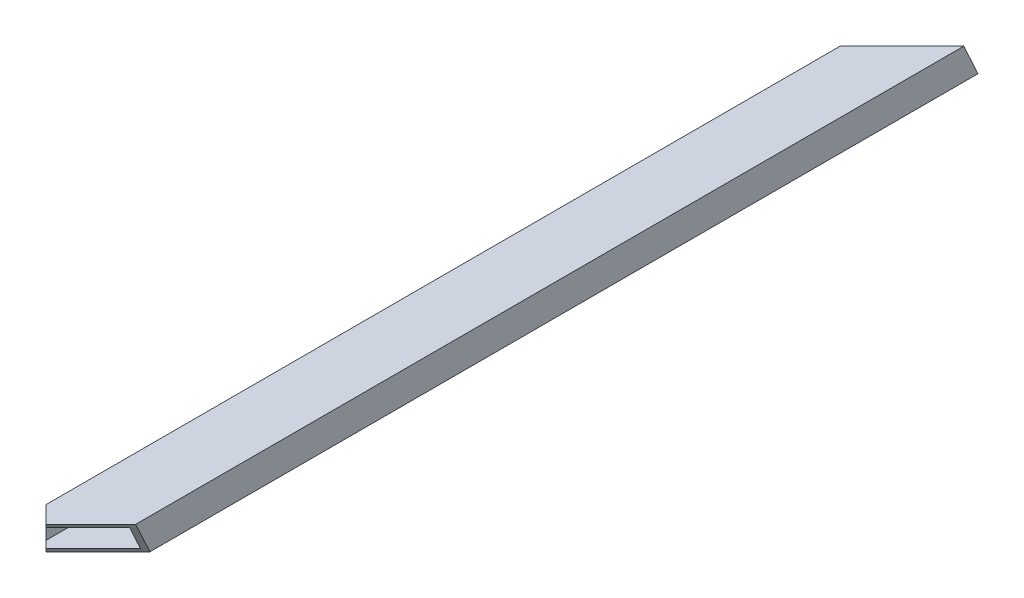
ISO-10303-21;
HEADER;
FILE_DESCRIPTION(('STEP AP214'),'2;1');
FILE_NAME('part.step','',(''),(''),'','','');
FILE_SCHEMA(('AUTOMOTIVE_DESIGN { 1 0 10303 214 1 1 1 1 }'));
ENDSEC;
DATA;
#1=APPLICATION_CONTEXT('core data for automotive mechanical design processes');
#2=APPLICATION_PROTOCOL_DEFINITION('international standard','automotive_design',2000,#1);
#3=PRODUCT_CONTEXT('',#1,'mechanical');
#4=PRODUCT('Part','Part','',(#3));
#5=PRODUCT_RELATED_PRODUCT_CATEGORY('part','',(#4));
#6=PRODUCT_DEFINITION_FORMATION('','',#4);
#7=PRODUCT_DEFINITION_CONTEXT('part definition',#1,'design');
#8=PRODUCT_DEFINITION('design','',#6,#7);
#9=PRODUCT_DEFINITION_SHAPE('','',#8);
#10=(LENGTH_UNIT() NAMED_UNIT(*) SI_UNIT(.MILLI.,.METRE.));
#11=(NAMED_UNIT(*) PLANE_ANGLE_UNIT() SI_UNIT($,.RADIAN.));
#12=(NAMED_UNIT(*) SI_UNIT($,.STERADIAN.) SOLID_ANGLE_UNIT());
#13=UNCERTAINTY_MEASURE_WITH_UNIT(LENGTH_MEASURE(1.E-05),#10,'distance_accuracy_value','');
#14=(GEOMETRIC_REPRESENTATION_CONTEXT(3) GLOBAL_UNCERTAINTY_ASSIGNED_CONTEXT((#13)) GLOBAL_UNIT_ASSIGNED_CONTEXT((#10,
#11,#12)) REPRESENTATION_CONTEXT('',''));
#15=CARTESIAN_POINT('',(0.,0.,0.));
#16=DIRECTION('',(0.,0.,1.));
#17=DIRECTION('',(1.,0.,0.));
#18=AXIS2_PLACEMENT_3D('',#15,#16,#17);
#19=CARTESIAN_POINT('',(-25.4,12.7,771.9314));
#20=DIRECTION('',(0.,-1.,0.));
#21=DIRECTION('',(0.,0.,-1.));
#22=AXIS2_PLACEMENT_3D('',#19,#20,#21);
#23=PLANE('',#22);
#24=DIRECTION('',(-0.707106781186552,0.,-0.707106781186543));
#25=VECTOR('',#24,1.);
#26=CARTESIAN_POINT('',(3.3872449600659,12.7,743.144155039934));
#27=LINE('',#26,#25);
#28=CARTESIAN_POINT('',(-11.4163281476384,12.6999999999999,728.340581932229));
#29=VERTEX_POINT('',#28);
#30=CARTESIAN_POINT('',(-25.4,12.7,714.356910079868));
#31=VERTEX_POINT('',#30);
#32=EDGE_CURVE('E121',#29,#31,#27,.T.);
#33=ORIENTED_EDGE('',*,*,#32,.F.);
#34=DIRECTION('',(0.707106781186542,0.,-0.707106781186553));
#35=VECTOR('',#34,1.);
#36=CARTESIAN_POINT('',(-40.2035731077044,12.6999999999999,757.127826892296));
#37=LINE('',#36,#35);
#38=CARTESIAN_POINT('',(25.4,12.6999999999999,691.52425378459));
#39=VERTEX_POINT('',#38);
#40=EDGE_CURVE('E107',#29,#39,#37,.T.);
#41=ORIENTED_EDGE('',*,*,#40,.T.);
#42=DIRECTION('',(0.,0.,-1.));
#43=VECTOR('',#42,1.);
#44=CARTESIAN_POINT('',(25.4,12.7,771.9314));
#45=LINE('',#44,#43);
#46=CARTESIAN_POINT('',(25.4,12.6999999999965,11.6714483638042));
#47=VERTEX_POINT('',#46);
#48=EDGE_CURVE('E147',#39,#47,#45,.T.);
#49=ORIENTED_EDGE('',*,*,#48,.T.);
#50=DIRECTION('',(0.707106781186541,0.,-0.707106781186554));
#51=VECTOR('',#50,1.);
#52=CARTESIAN_POINT('',(-380.129975818097,12.6999999999985,417.201424181909));
#53=LINE('',#52,#51);
#54=CARTESIAN_POINT('',(-25.4,12.6999999999968,62.4714483638051));
#55=VERTEX_POINT('',#54);
#56=EDGE_CURVE('E180',#55,#47,#53,.T.);
#57=ORIENTED_EDGE('',*,*,#56,.F.);
#58=DIRECTION('',(0.,0.,-1.));
#59=VECTOR('',#58,1.);
#60=CARTESIAN_POINT('',(-25.4,12.7,771.9314));
#61=LINE('',#60,#59);
#62=EDGE_CURVE('E128',#31,#55,#61,.T.);
#63=ORIENTED_EDGE('',*,*,#62,.F.);
#64=EDGE_LOOP('',(#33,#41,#49,#57,#63));
#65=FACE_BOUND('',#64,.T.);
#66=ADVANCED_FACE('F33',(#65),#23,.F.);
#67=CARTESIAN_POINT('',(-25.4,-12.7,771.9314));
#68=DIRECTION('',(1.,0.,0.));
#69=DIRECTION('',(0.,0.,-1.));
#70=AXIS2_PLACEMENT_3D('',#67,#68,#69);
#71=PLANE('',#70);
#72=ORIENTED_EDGE('',*,*,#62,.T.);
#73=DIRECTION('',(0.,-0.908660854566041,-0.417534970247179));
#74=VECTOR('',#73,1.);
#75=CARTESIAN_POINT('',(-25.4,260.895582209131,176.518768122797));
#76=LINE('',#75,#74);
#77=CARTESIAN_POINT('',(-25.399999999999,-12.6999999999979,50.8000000000017));
#78=VERTEX_POINT('',#77);
#79=EDGE_CURVE('E165',#55,#78,#76,.T.);
#80=ORIENTED_EDGE('',*,*,#79,.T.);
#81=DIRECTION('',(0.,0.,-1.));
#82=VECTOR('',#81,1.);
#83=CARTESIAN_POINT('',(-25.4,-12.7,771.9314));
#84=LINE('',#83,#82);
#85=CARTESIAN_POINT('',(-25.4,-12.7,714.356910079868));
#86=VERTEX_POINT('',#85);
#87=EDGE_CURVE('E146',#86,#78,#84,.T.);
#88=ORIENTED_EDGE('',*,*,#87,.F.);
#89=DIRECTION('',(0.,-1.,0.));
#90=VECTOR('',#89,1.);
#91=CARTESIAN_POINT('',(-25.4,-12.7,714.356910079868));
#92=LINE('',#91,#90);
#93=EDGE_CURVE('E129',#31,#86,#92,.T.);
#94=ORIENTED_EDGE('',*,*,#93,.F.);
#95=EDGE_LOOP('',(#72,#80,#88,#94));
#96=FACE_BOUND('',#95,.T.);
#97=ADVANCED_FACE('F196',(#96),#71,.F.);
#98=CARTESIAN_POINT('',(-25.4,-12.7,771.9314));
#99=DIRECTION('',(0.,1.,0.));
#100=DIRECTION('',(0.,0.,1.));
#101=AXIS2_PLACEMENT_3D('',#98,#99,#100);
#102=PLANE('',#101);
#103=DIRECTION('',(0.,0.,-1.));
#104=VECTOR('',#103,1.);
#105=CARTESIAN_POINT('',(25.4,-12.7,771.9314));
#106=LINE('',#105,#104);
#107=CARTESIAN_POINT('',(25.4,-12.7,679.852805420786));
#108=VERTEX_POINT('',#107);
#109=CARTESIAN_POINT('',(25.4,-12.7,0.));
#110=VERTEX_POINT('',#109);
#111=EDGE_CURVE('E158',#108,#110,#106,.T.);
#112=ORIENTED_EDGE('',*,*,#111,.F.);
#113=DIRECTION('',(0.707106781186542,0.,-0.707106781186553));
#114=VECTOR('',#113,1.);
#115=CARTESIAN_POINT('',(-46.0392972896068,-12.7,751.292102710393));
#116=LINE('',#115,#114);
#117=CARTESIAN_POINT('',(-17.2520523295409,-12.7,722.504857750327));
#118=VERTEX_POINT('',#117);
#119=EDGE_CURVE('E116',#118,#108,#116,.T.);
#120=ORIENTED_EDGE('',*,*,#119,.F.);
#121=DIRECTION('',(0.707106781186552,0.,0.707106781186543));
#122=VECTOR('',#121,1.);
#123=CARTESIAN_POINT('',(3.3872449600659,-12.7,743.144155039934));
#124=LINE('',#123,#122);
#125=EDGE_CURVE('E130',#86,#118,#124,.T.);
#126=ORIENTED_EDGE('',*,*,#125,.F.);
#127=ORIENTED_EDGE('',*,*,#87,.T.);
#128=DIRECTION('',(0.707106781186541,0.,-0.707106781186554));
#129=VECTOR('',#128,1.);
#130=CARTESIAN_POINT('',(25.4,-12.7,0.));
#131=LINE('',#130,#129);
#132=EDGE_CURVE('E143',#78,#110,#131,.T.);
#133=ORIENTED_EDGE('',*,*,#132,.T.);
#134=EDGE_LOOP('',(#112,#120,#126,#127,#133));
#135=FACE_BOUND('',#134,.T.);
#136=ADVANCED_FACE('F193',(#135),#102,.F.);
#137=CARTESIAN_POINT('',(-22.225,-9.525,771.9314));
#138=DIRECTION('',(1.,0.,0.));
#139=DIRECTION('',(0.,0.,-1.));
#140=AXIS2_PLACEMENT_3D('',#137,#138,#139);
#141=PLANE('',#140);
#142=DIRECTION('',(0.,-0.908660854566041,-0.417534970247179));
#143=VECTOR('',#142,1.);
#144=CARTESIAN_POINT('',(-22.225,264.721654794133,175.101870824058));
#145=LINE('',#144,#143);
#146=CARTESIAN_POINT('',(-22.2250000000001,9.525,57.8375173183311));
#147=VERTEX_POINT('',#146);
#148=CARTESIAN_POINT('',(-22.2250000000001,-9.525,49.0839310454775));
#149=VERTEX_POINT('',#148);
#150=EDGE_CURVE('E171',#147,#149,#145,.T.);
#151=ORIENTED_EDGE('',*,*,#150,.F.);
#152=DIRECTION('',(0.,0.,-1.));
#153=VECTOR('',#152,1.);
#154=CARTESIAN_POINT('',(-22.225,9.525,771.9314));
#155=LINE('',#154,#153);
#156=CARTESIAN_POINT('',(-22.225,9.525,717.531910079868));
#157=VERTEX_POINT('',#156);
#158=EDGE_CURVE('E145',#157,#147,#155,.T.);
#159=ORIENTED_EDGE('',*,*,#158,.F.);
#160=DIRECTION('',(0.,-1.,0.));
#161=VECTOR('',#160,1.);
#162=CARTESIAN_POINT('',(-22.225,-9.525,717.531910079868));
#163=LINE('',#162,#161);
#164=CARTESIAN_POINT('',(-22.225,-9.525,717.531910079868));
#165=VERTEX_POINT('',#164);
#166=EDGE_CURVE('E139',#157,#165,#163,.T.);
#167=ORIENTED_EDGE('',*,*,#166,.T.);
#168=DIRECTION('',(0.,0.,-1.));
#169=VECTOR('',#168,1.);
#170=CARTESIAN_POINT('',(-22.225,-9.525,771.9314));
#171=LINE('',#170,#169);
#172=EDGE_CURVE('E142',#165,#149,#171,.T.);
#173=ORIENTED_EDGE('',*,*,#172,.T.);
#174=EDGE_LOOP('',(#151,#159,#167,#173));
#175=FACE_BOUND('',#174,.T.);
#176=ADVANCED_FACE('F195',(#175),#141,.T.);
#177=CARTESIAN_POINT('',(-22.225,-9.525,771.9314));
#178=DIRECTION('',(0.,1.,0.));
#179=DIRECTION('',(0.,0.,1.));
#180=AXIS2_PLACEMENT_3D('',#177,#178,#179);
#181=PLANE('',#180);
#182=DIRECTION('',(-0.707106781186543,0.,0.707106781186553));
#183=VECTOR('',#182,1.);
#184=CARTESIAN_POINT('',(-43.722331766869,-9.525,750.434068233131));
#185=LINE('',#184,#183);
#186=CARTESIAN_POINT('',(22.225,-9.525,684.486736466261));
#187=VERTEX_POINT('',#186);
#188=CARTESIAN_POINT('',(-16.5225868068032,-9.52499999999999,723.234323273065));
#189=VERTEX_POINT('',#188);
#190=EDGE_CURVE('E47',#187,#189,#185,.T.);
#191=ORIENTED_EDGE('',*,*,#190,.F.);
#192=DIRECTION('',(0.,0.,-1.));
#193=VECTOR('',#192,1.);
#194=CARTESIAN_POINT('',(22.225,-9.525,771.9314));
#195=LINE('',#194,#193);
#196=CARTESIAN_POINT('',(22.225,-9.525,4.63393104547669));
#197=VERTEX_POINT('',#196);
#198=EDGE_CURVE('E54',#187,#197,#195,.T.);
#199=ORIENTED_EDGE('',*,*,#198,.T.);
#200=DIRECTION('',(0.707106781186542,0.,-0.707106781186553));
#201=VECTOR('',#200,1.);
#202=CARTESIAN_POINT('',(-383.648734477261,-9.525,410.507665522745));
#203=LINE('',#202,#201);
#204=EDGE_CURVE('E173',#149,#197,#203,.T.);
#205=ORIENTED_EDGE('',*,*,#204,.F.);
#206=ORIENTED_EDGE('',*,*,#172,.F.);
#207=DIRECTION('',(0.707106781186552,0.,0.707106781186543));
#208=VECTOR('',#207,1.);
#209=CARTESIAN_POINT('',(4.97474496006592,-9.525,744.731655039934));
#210=LINE('',#209,#208);
#211=EDGE_CURVE('E138',#165,#189,#210,.T.);
#212=ORIENTED_EDGE('',*,*,#211,.T.);
#213=EDGE_LOOP('',(#191,#199,#205,#206,#212));
#214=FACE_BOUND('',#213,.T.);
#215=ADVANCED_FACE('F202',(#214),#181,.T.);
#216=CARTESIAN_POINT('',(-22.225,9.525,771.9314));
#217=DIRECTION('',(0.,-1.,0.));
#218=DIRECTION('',(1.,0.,0.));
#219=AXIS2_PLACEMENT_3D('',#216,#217,#218);
#220=PLANE('',#219);
#221=DIRECTION('',(0.707106781186543,0.,-0.707106781186553));
#222=VECTOR('',#221,1.);
#223=CARTESIAN_POINT('',(-39.3455386304422,9.525,754.810861369558));
#224=LINE('',#223,#222);
#225=CARTESIAN_POINT('',(-12.1457936703763,9.525,727.611116409492));
#226=VERTEX_POINT('',#225);
#227=CARTESIAN_POINT('',(22.225,9.525,693.240322739115));
#228=VERTEX_POINT('',#227);
#229=EDGE_CURVE('E184',#226,#228,#224,.T.);
#230=ORIENTED_EDGE('',*,*,#229,.F.);
#231=DIRECTION('',(-0.707106781186552,0.,-0.707106781186543));
#232=VECTOR('',#231,1.);
#233=CARTESIAN_POINT('',(4.97474496006592,9.525,744.731655039934));
#234=LINE('',#233,#232);
#235=EDGE_CURVE('E124',#226,#157,#234,.T.);
#236=ORIENTED_EDGE('',*,*,#235,.T.);
#237=ORIENTED_EDGE('',*,*,#158,.T.);
#238=DIRECTION('',(-0.707106781186542,0.,0.707106781186553));
#239=VECTOR('',#238,1.);
#240=CARTESIAN_POINT('',(-379.271941340834,9.52499999999998,414.884458659171));
#241=LINE('',#240,#239);
#242=CARTESIAN_POINT('',(22.225,9.52499999999995,13.3875173183303));
#243=VERTEX_POINT('',#242);
#244=EDGE_CURVE('E175',#243,#147,#241,.T.);
#245=ORIENTED_EDGE('',*,*,#244,.F.);
#246=DIRECTION('',(0.,0.,-1.));
#247=VECTOR('',#246,1.);
#248=CARTESIAN_POINT('',(22.225,9.525,771.9314));
#249=LINE('',#248,#247);
#250=EDGE_CURVE('E134',#228,#243,#249,.T.);
#251=ORIENTED_EDGE('',*,*,#250,.F.);
#252=EDGE_LOOP('',(#230,#236,#237,#245,#251));
#253=FACE_BOUND('',#252,.T.);
#254=ADVANCED_FACE('F267',(#253),#220,.T.);
#255=CARTESIAN_POINT('',(25.4,-12.7,771.9314));
#256=DIRECTION('',(-1.,0.,0.));
#257=DIRECTION('',(0.,0.,1.));
#258=AXIS2_PLACEMENT_3D('',#255,#256,#257);
#259=PLANE('',#258);
#260=ORIENTED_EDGE('',*,*,#48,.F.);
#261=DIRECTION('',(0.,-0.90866085456604,-0.417534970247181));
#262=VECTOR('',#261,1.);
#263=CARTESIAN_POINT('',(25.4,22.2344054258334,695.905368769126));
#264=LINE('',#263,#262);
#265=EDGE_CURVE('E112',#39,#108,#264,.T.);
#266=ORIENTED_EDGE('',*,*,#265,.T.);
#267=ORIENTED_EDGE('',*,*,#111,.T.);
#268=DIRECTION('',(0.,0.908660854566041,0.417534970247179));
#269=VECTOR('',#268,1.);
#270=CARTESIAN_POINT('',(25.4,280.168984499233,134.575009052866));
#271=LINE('',#270,#269);
#272=EDGE_CURVE('E168',#110,#47,#271,.T.);
#273=ORIENTED_EDGE('',*,*,#272,.T.);
#274=EDGE_LOOP('',(#260,#266,#267,#273));
#275=FACE_BOUND('',#274,.T.);
#276=ADVANCED_FACE('F191',(#275),#259,.F.);
#277=CARTESIAN_POINT('',(22.225,-9.525,771.9314));
#278=DIRECTION('',(-1.,0.,0.));
#279=DIRECTION('',(0.,-1.,0.));
#280=AXIS2_PLACEMENT_3D('',#277,#278,#279);
#281=PLANE('',#280);
#282=DIRECTION('',(0.,-0.90866085456604,-0.417534970247181));
#283=VECTOR('',#282,1.);
#284=CARTESIAN_POINT('',(22.225,23.6513027245728,699.731441354128));
#285=LINE('',#284,#283);
#286=EDGE_CURVE('E186',#228,#187,#285,.T.);
#287=ORIENTED_EDGE('',*,*,#286,.F.);
#288=ORIENTED_EDGE('',*,*,#250,.T.);
#289=DIRECTION('',(0.,0.908660854566041,0.41753497024718));
#290=VECTOR('',#289,1.);
#291=CARTESIAN_POINT('',(22.2249999999999,281.585881797972,138.401081637868));
#292=LINE('',#291,#290);
#293=EDGE_CURVE('E177',#197,#243,#292,.T.);
#294=ORIENTED_EDGE('',*,*,#293,.F.);
#295=ORIENTED_EDGE('',*,*,#198,.F.);
#296=EDGE_LOOP('',(#287,#288,#294,#295));
#297=FACE_BOUND('',#296,.T.);
#298=ADVANCED_FACE('F252',(#297),#281,.T.);
#299=CARTESIAN_POINT('',(-369.878455039934,0.,369.878455039939));
#300=DIRECTION('',(-0.707106781186543,0.,0.707106781186552));
#301=DIRECTION('',(0.707106781186552,0.,0.707106781186543));
#302=AXIS2_PLACEMENT_3D('',#299,#300,#301);
#303=PLANE('',#302);
#304=DIRECTION('',(-0.218508012224394,-0.951056516295162,-0.218508012224391));
#305=VECTOR('',#304,1.);
#306=CARTESIAN_POINT('',(-48.2856464008391,-147.773774023706,691.471263679029));
#307=LINE('',#306,#305);
#308=EDGE_CURVE('E11',#29,#226,#307,.T.);
#309=ORIENTED_EDGE('',*,*,#308,.F.);
#310=ORIENTED_EDGE('',*,*,#32,.T.);
#311=ORIENTED_EDGE('',*,*,#93,.T.);
#312=ORIENTED_EDGE('',*,*,#125,.T.);
#313=EDGE_CURVE('E36',#189,#118,#307,.T.);
#314=ORIENTED_EDGE('',*,*,#313,.F.);
#315=ORIENTED_EDGE('',*,*,#211,.F.);
#316=ORIENTED_EDGE('',*,*,#166,.F.);
#317=ORIENTED_EDGE('',*,*,#235,.F.);
#318=EDGE_LOOP('',(#309,#310,#311,#312,#314,#315,#316,#317));
#319=FACE_BOUND('',#318,.T.);
#320=ADVANCED_FACE('F120',(#319),#303,.T.);
#321=CARTESIAN_POINT('',(-385.965699999999,-12.6999999999961,411.365700000008));
#322=DIRECTION('',(0.672498511963969,-0.30901699437492,0.672498511963958));
#323=DIRECTION('',(0.707106781186542,0.,-0.707106781186553));
#324=AXIS2_PLACEMENT_3D('',#321,#322,#323);
#325=PLANE('',#324);
#326=ORIENTED_EDGE('',*,*,#150,.T.);
#327=ORIENTED_EDGE('',*,*,#204,.T.);
#328=ORIENTED_EDGE('',*,*,#293,.T.);
#329=ORIENTED_EDGE('',*,*,#244,.T.);
#330=EDGE_LOOP('',(#326,#327,#328,#329));
#331=FACE_BOUND('',#330,.T.);
#332=ORIENTED_EDGE('',*,*,#56,.T.);
#333=ORIENTED_EDGE('',*,*,#272,.F.);
#334=ORIENTED_EDGE('',*,*,#132,.F.);
#335=ORIENTED_EDGE('',*,*,#79,.F.);
#336=EDGE_LOOP('',(#332,#333,#334,#335));
#337=FACE_BOUND('',#336,.T.);
#338=ADVANCED_FACE('F228',(#331,#337),#325,.F.);
#339=CARTESIAN_POINT('',(-46.0392972896068,-12.7,751.292102710393));
#340=DIRECTION('',(-0.672498511963968,0.309016994374921,-0.672498511963959));
#341=DIRECTION('',(-0.707106781186543,0.,0.707106781186553));
#342=AXIS2_PLACEMENT_3D('',#339,#340,#341);
#343=PLANE('',#342);
#344=ORIENTED_EDGE('',*,*,#40,.F.);
#345=ORIENTED_EDGE('',*,*,#308,.T.);
#346=ORIENTED_EDGE('',*,*,#229,.T.);
#347=ORIENTED_EDGE('',*,*,#286,.T.);
#348=ORIENTED_EDGE('',*,*,#190,.T.);
#349=ORIENTED_EDGE('',*,*,#313,.T.);
#350=ORIENTED_EDGE('',*,*,#119,.T.);
#351=ORIENTED_EDGE('',*,*,#265,.F.);
#352=EDGE_LOOP('',(#344,#345,#346,#347,#348,#349,#350,#351));
#353=FACE_BOUND('',#352,.T.);
#354=ADVANCED_FACE('F109',(#353),#343,.F.);
#355=CLOSED_SHELL('',(#66,#97,#136,#176,#215,#254,#276,#298,#320,#338,#354));
#356=MANIFOLD_SOLID_BREP('B2',#355);
#357=ADVANCED_BREP_SHAPE_REPRESENTATION('',(#18,#356),#14);
#358=SHAPE_DEFINITION_REPRESENTATION(#9,#357);
ENDSEC;
END-ISO-10303-21;
